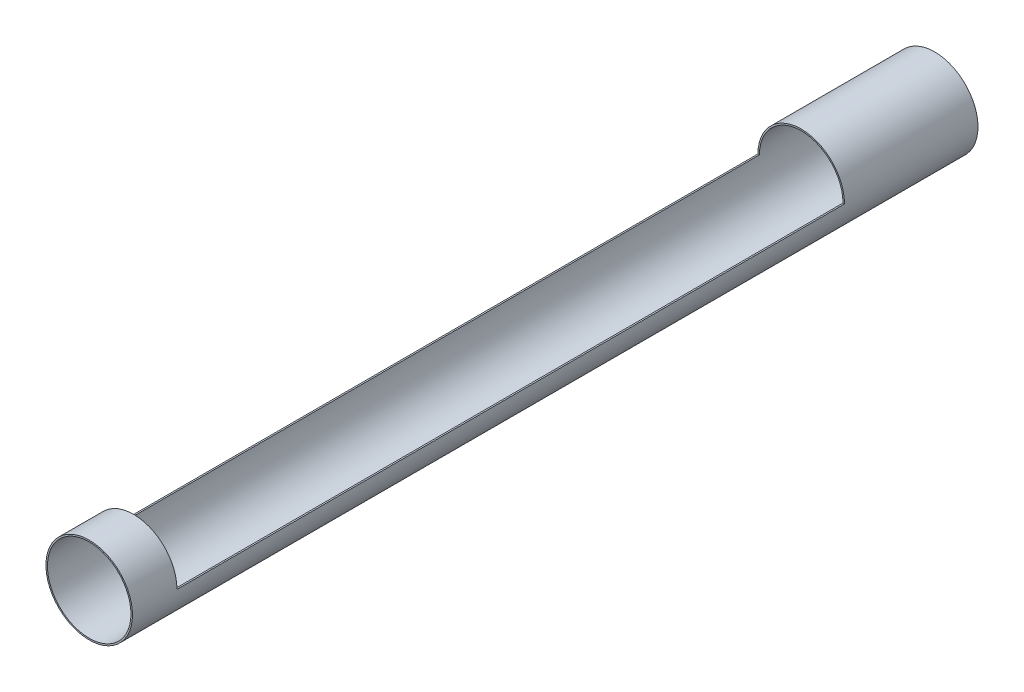
ISO-10303-21;
HEADER;
FILE_DESCRIPTION(('STEP AP214'),'2;1');
FILE_NAME('part.step','',(''),(''),'','','');
FILE_SCHEMA(('AUTOMOTIVE_DESIGN { 1 0 10303 214 1 1 1 1 }'));
ENDSEC;
DATA;
#1=APPLICATION_CONTEXT('core data for automotive mechanical design processes');
#2=APPLICATION_PROTOCOL_DEFINITION('international standard','automotive_design',2000,#1);
#3=PRODUCT_CONTEXT('',#1,'mechanical');
#4=PRODUCT('Part','Part','',(#3));
#5=PRODUCT_RELATED_PRODUCT_CATEGORY('part','',(#4));
#6=PRODUCT_DEFINITION_FORMATION('','',#4);
#7=PRODUCT_DEFINITION_CONTEXT('part definition',#1,'design');
#8=PRODUCT_DEFINITION('design','',#6,#7);
#9=PRODUCT_DEFINITION_SHAPE('','',#8);
#10=(LENGTH_UNIT() NAMED_UNIT(*) SI_UNIT(.MILLI.,.METRE.));
#11=(NAMED_UNIT(*) PLANE_ANGLE_UNIT() SI_UNIT($,.RADIAN.));
#12=(NAMED_UNIT(*) SI_UNIT($,.STERADIAN.) SOLID_ANGLE_UNIT());
#13=UNCERTAINTY_MEASURE_WITH_UNIT(LENGTH_MEASURE(1.E-05),#10,'distance_accuracy_value','');
#14=(GEOMETRIC_REPRESENTATION_CONTEXT(3) GLOBAL_UNCERTAINTY_ASSIGNED_CONTEXT((#13)) GLOBAL_UNIT_ASSIGNED_CONTEXT((#10,
#11,#12)) REPRESENTATION_CONTEXT('',''));
#15=CARTESIAN_POINT('',(0.,0.,0.));
#16=DIRECTION('',(0.,0.,1.));
#17=DIRECTION('',(1.,0.,0.));
#18=AXIS2_PLACEMENT_3D('',#15,#16,#17);
#19=CARTESIAN_POINT('',(0.,0.,152.4));
#20=DIRECTION('',(0.,0.,1.));
#21=DIRECTION('',(1.,0.,0.));
#22=AXIS2_PLACEMENT_3D('',#19,#20,#21);
#23=PLANE('',#22);
#24=DIRECTION('',(-1.,0.,0.));
#25=VECTOR('',#24,1.);
#26=CARTESIAN_POINT('',(47.6885,0.,152.4));
#27=LINE('',#26,#25);
#28=CARTESIAN_POINT('',(49.403,0.,152.4));
#29=VERTEX_POINT('',#28);
#30=CARTESIAN_POINT('',(47.6885,0.,152.4));
#31=VERTEX_POINT('',#30);
#32=EDGE_CURVE('E81',#29,#31,#27,.T.);
#33=ORIENTED_EDGE('',*,*,#32,.F.);
#34=CARTESIAN_POINT('',(0.,0.,152.4));
#35=DIRECTION('',(0.,0.,1.));
#36=DIRECTION('',(1.,0.,0.));
#37=AXIS2_PLACEMENT_3D('',#34,#35,#36);
#38=CIRCLE('',#37,49.403);
#39=CARTESIAN_POINT('',(-49.403,0.,152.4));
#40=VERTEX_POINT('',#39);
#41=EDGE_CURVE('E11',#29,#40,#38,.T.);
#42=ORIENTED_EDGE('',*,*,#41,.T.);
#43=DIRECTION('',(-1.,0.,0.));
#44=VECTOR('',#43,1.);
#45=CARTESIAN_POINT('',(-49.403,0.,152.4));
#46=LINE('',#45,#44);
#47=CARTESIAN_POINT('',(-47.6885,0.,152.4));
#48=VERTEX_POINT('',#47);
#49=EDGE_CURVE('E51',#48,#40,#46,.T.);
#50=ORIENTED_EDGE('',*,*,#49,.F.);
#51=CARTESIAN_POINT('',(0.,0.,152.4));
#52=DIRECTION('',(0.,0.,1.));
#53=DIRECTION('',(1.,0.,0.));
#54=AXIS2_PLACEMENT_3D('',#51,#52,#53);
#55=CIRCLE('',#54,47.6885);
#56=EDGE_CURVE('E55',#31,#48,#55,.T.);
#57=ORIENTED_EDGE('',*,*,#56,.F.);
#58=EDGE_LOOP('',(#33,#42,#50,#57));
#59=FACE_BOUND('',#58,.T.);
#60=ADVANCED_FACE('F37',(#59),#23,.T.);
#61=CARTESIAN_POINT('',(0.,0.,0.));
#62=DIRECTION('',(0.,0.,1.));
#63=DIRECTION('',(1.,0.,0.));
#64=AXIS2_PLACEMENT_3D('',#61,#62,#63);
#65=PLANE('',#64);
#66=CARTESIAN_POINT('',(0.,0.,0.));
#67=DIRECTION('',(0.,0.,1.));
#68=DIRECTION('',(1.,0.,0.));
#69=AXIS2_PLACEMENT_3D('',#66,#67,#68);
#70=CIRCLE('',#69,49.403);
#71=CARTESIAN_POINT('',(49.403,0.,0.));
#72=VERTEX_POINT('',#71);
#73=EDGE_CURVE('E41',#72,#72,#70,.T.);
#74=ORIENTED_EDGE('',*,*,#73,.F.);
#75=EDGE_LOOP('',(#74));
#76=FACE_BOUND('',#75,.T.);
#77=CARTESIAN_POINT('',(0.,0.,0.));
#78=DIRECTION('',(0.,0.,1.));
#79=DIRECTION('',(1.,0.,0.));
#80=AXIS2_PLACEMENT_3D('',#77,#78,#79);
#81=CIRCLE('',#80,47.6885);
#82=CARTESIAN_POINT('',(47.6885,0.,0.));
#83=VERTEX_POINT('',#82);
#84=EDGE_CURVE('E117',#83,#83,#81,.T.);
#85=ORIENTED_EDGE('',*,*,#84,.T.);
#86=EDGE_LOOP('',(#85));
#87=FACE_BOUND('',#86,.T.);
#88=ADVANCED_FACE('F122',(#76,#87),#65,.F.);
#89=CARTESIAN_POINT('',(0.,0.,152.4));
#90=DIRECTION('',(0.,0.,-1.));
#91=DIRECTION('',(-1.,0.,0.));
#92=AXIS2_PLACEMENT_3D('',#89,#90,#91);
#93=CYLINDRICAL_SURFACE('',#92,49.403);
#94=ORIENTED_EDGE('',*,*,#41,.F.);
#95=DIRECTION('',(0.,0.,-1.));
#96=VECTOR('',#95,1.);
#97=CARTESIAN_POINT('',(49.403,0.,914.4));
#98=LINE('',#97,#96);
#99=CARTESIAN_POINT('',(49.403,0.,914.4));
#100=VERTEX_POINT('',#99);
#101=EDGE_CURVE('E84',#100,#29,#98,.T.);
#102=ORIENTED_EDGE('',*,*,#101,.F.);
#103=CARTESIAN_POINT('',(0.,0.,914.4));
#104=DIRECTION('',(0.,0.,1.));
#105=DIRECTION('',(1.,0.,0.));
#106=AXIS2_PLACEMENT_3D('',#103,#104,#105);
#107=CIRCLE('',#106,49.403);
#108=CARTESIAN_POINT('',(-49.403,0.,914.4));
#109=VERTEX_POINT('',#108);
#110=EDGE_CURVE('E92',#100,#109,#107,.T.);
#111=ORIENTED_EDGE('',*,*,#110,.T.);
#112=DIRECTION('',(0.,0.,-1.));
#113=VECTOR('',#112,1.);
#114=CARTESIAN_POINT('',(-49.403,0.,914.4));
#115=LINE('',#114,#113);
#116=EDGE_CURVE('E113',#109,#40,#115,.T.);
#117=ORIENTED_EDGE('',*,*,#116,.T.);
#118=EDGE_LOOP('',(#94,#102,#111,#117));
#119=FACE_BOUND('',#118,.T.);
#120=ORIENTED_EDGE('',*,*,#73,.T.);
#121=EDGE_LOOP('',(#120));
#122=FACE_BOUND('',#121,.T.);
#123=CARTESIAN_POINT('',(0.,0.,965.2));
#124=DIRECTION('',(0.,0.,1.));
#125=DIRECTION('',(1.,0.,0.));
#126=AXIS2_PLACEMENT_3D('',#123,#124,#125);
#127=CIRCLE('',#126,49.403);
#128=CARTESIAN_POINT('',(49.403,0.,965.2));
#129=VERTEX_POINT('',#128);
#130=EDGE_CURVE('E105',#129,#129,#127,.T.);
#131=ORIENTED_EDGE('',*,*,#130,.F.);
#132=EDGE_LOOP('',(#131));
#133=FACE_BOUND('',#132,.T.);
#134=ADVANCED_FACE('F39',(#119,#122,#133),#93,.T.);
#135=CARTESIAN_POINT('',(0.,0.,152.4));
#136=DIRECTION('',(0.,0.,-1.));
#137=DIRECTION('',(-1.,0.,0.));
#138=AXIS2_PLACEMENT_3D('',#135,#136,#137);
#139=CYLINDRICAL_SURFACE('',#138,47.6885);
#140=ORIENTED_EDGE('',*,*,#56,.T.);
#141=DIRECTION('',(0.,0.,-1.));
#142=VECTOR('',#141,1.);
#143=CARTESIAN_POINT('',(-47.6885,0.,914.4));
#144=LINE('',#143,#142);
#145=CARTESIAN_POINT('',(-47.6885,0.,914.4));
#146=VERTEX_POINT('',#145);
#147=EDGE_CURVE('E99',#146,#48,#144,.T.);
#148=ORIENTED_EDGE('',*,*,#147,.F.);
#149=CARTESIAN_POINT('',(0.,0.,914.4));
#150=DIRECTION('',(0.,0.,1.));
#151=DIRECTION('',(1.,0.,0.));
#152=AXIS2_PLACEMENT_3D('',#149,#150,#151);
#153=CIRCLE('',#152,47.6885);
#154=CARTESIAN_POINT('',(47.6885,0.,914.4));
#155=VERTEX_POINT('',#154);
#156=EDGE_CURVE('E90',#155,#146,#153,.T.);
#157=ORIENTED_EDGE('',*,*,#156,.F.);
#158=DIRECTION('',(0.,0.,-1.));
#159=VECTOR('',#158,1.);
#160=CARTESIAN_POINT('',(47.6885,0.,914.4));
#161=LINE('',#160,#159);
#162=EDGE_CURVE('E75',#155,#31,#161,.T.);
#163=ORIENTED_EDGE('',*,*,#162,.T.);
#164=EDGE_LOOP('',(#140,#148,#157,#163));
#165=FACE_BOUND('',#164,.T.);
#166=ORIENTED_EDGE('',*,*,#84,.F.);
#167=EDGE_LOOP('',(#166));
#168=FACE_BOUND('',#167,.T.);
#169=CARTESIAN_POINT('',(0.,0.,965.2));
#170=DIRECTION('',(0.,0.,1.));
#171=DIRECTION('',(1.,0.,0.));
#172=AXIS2_PLACEMENT_3D('',#169,#170,#171);
#173=CIRCLE('',#172,47.6885);
#174=CARTESIAN_POINT('',(47.6885,0.,965.2));
#175=VERTEX_POINT('',#174);
#176=EDGE_CURVE('E100',#175,#175,#173,.T.);
#177=ORIENTED_EDGE('',*,*,#176,.T.);
#178=EDGE_LOOP('',(#177));
#179=FACE_BOUND('',#178,.T.);
#180=ADVANCED_FACE('F96',(#165,#168,#179),#139,.F.);
#181=CARTESIAN_POINT('',(-49.403,0.,914.4));
#182=DIRECTION('',(0.,-1.,0.));
#183=DIRECTION('',(0.,0.,-1.));
#184=AXIS2_PLACEMENT_3D('',#181,#182,#183);
#185=PLANE('',#184);
#186=ORIENTED_EDGE('',*,*,#49,.T.);
#187=ORIENTED_EDGE('',*,*,#116,.F.);
#188=DIRECTION('',(-1.,0.,0.));
#189=VECTOR('',#188,1.);
#190=CARTESIAN_POINT('',(-49.403,0.,914.4));
#191=LINE('',#190,#189);
#192=EDGE_CURVE('E93',#146,#109,#191,.T.);
#193=ORIENTED_EDGE('',*,*,#192,.F.);
#194=ORIENTED_EDGE('',*,*,#147,.T.);
#195=EDGE_LOOP('',(#186,#187,#193,#194));
#196=FACE_BOUND('',#195,.T.);
#197=ADVANCED_FACE('F125',(#196),#185,.F.);
#198=CARTESIAN_POINT('',(47.6885,0.,914.4));
#199=DIRECTION('',(0.,-1.,0.));
#200=DIRECTION('',(0.,0.,-1.));
#201=AXIS2_PLACEMENT_3D('',#198,#199,#200);
#202=PLANE('',#201);
#203=ORIENTED_EDGE('',*,*,#32,.T.);
#204=ORIENTED_EDGE('',*,*,#162,.F.);
#205=DIRECTION('',(-1.,0.,0.));
#206=VECTOR('',#205,1.);
#207=CARTESIAN_POINT('',(47.6885,0.,914.4));
#208=LINE('',#207,#206);
#209=EDGE_CURVE('E79',#100,#155,#208,.T.);
#210=ORIENTED_EDGE('',*,*,#209,.F.);
#211=ORIENTED_EDGE('',*,*,#101,.T.);
#212=EDGE_LOOP('',(#203,#204,#210,#211));
#213=FACE_BOUND('',#212,.T.);
#214=ADVANCED_FACE('F77',(#213),#202,.F.);
#215=CARTESIAN_POINT('',(0.,0.,914.4));
#216=DIRECTION('',(0.,0.,1.));
#217=DIRECTION('',(1.,0.,0.));
#218=AXIS2_PLACEMENT_3D('',#215,#216,#217);
#219=PLANE('',#218);
#220=ORIENTED_EDGE('',*,*,#156,.T.);
#221=ORIENTED_EDGE('',*,*,#192,.T.);
#222=ORIENTED_EDGE('',*,*,#110,.F.);
#223=ORIENTED_EDGE('',*,*,#209,.T.);
#224=EDGE_LOOP('',(#220,#221,#222,#223));
#225=FACE_BOUND('',#224,.T.);
#226=ADVANCED_FACE('F88',(#225),#219,.F.);
#227=CARTESIAN_POINT('',(0.,0.,965.2));
#228=DIRECTION('',(0.,0.,1.));
#229=DIRECTION('',(1.,0.,0.));
#230=AXIS2_PLACEMENT_3D('',#227,#228,#229);
#231=PLANE('',#230);
#232=ORIENTED_EDGE('',*,*,#130,.T.);
#233=EDGE_LOOP('',(#232));
#234=FACE_BOUND('',#233,.T.);
#235=ORIENTED_EDGE('',*,*,#176,.F.);
#236=EDGE_LOOP('',(#235));
#237=FACE_BOUND('',#236,.T.);
#238=ADVANCED_FACE('F129',(#234,#237),#231,.T.);
#239=CLOSED_SHELL('',(#60,#88,#134,#180,#197,#214,#226,#238));
#240=MANIFOLD_SOLID_BREP('B2',#239);
#241=ADVANCED_BREP_SHAPE_REPRESENTATION('',(#18,#240),#14);
#242=SHAPE_DEFINITION_REPRESENTATION(#9,#241);
ENDSEC;
END-ISO-10303-21;
